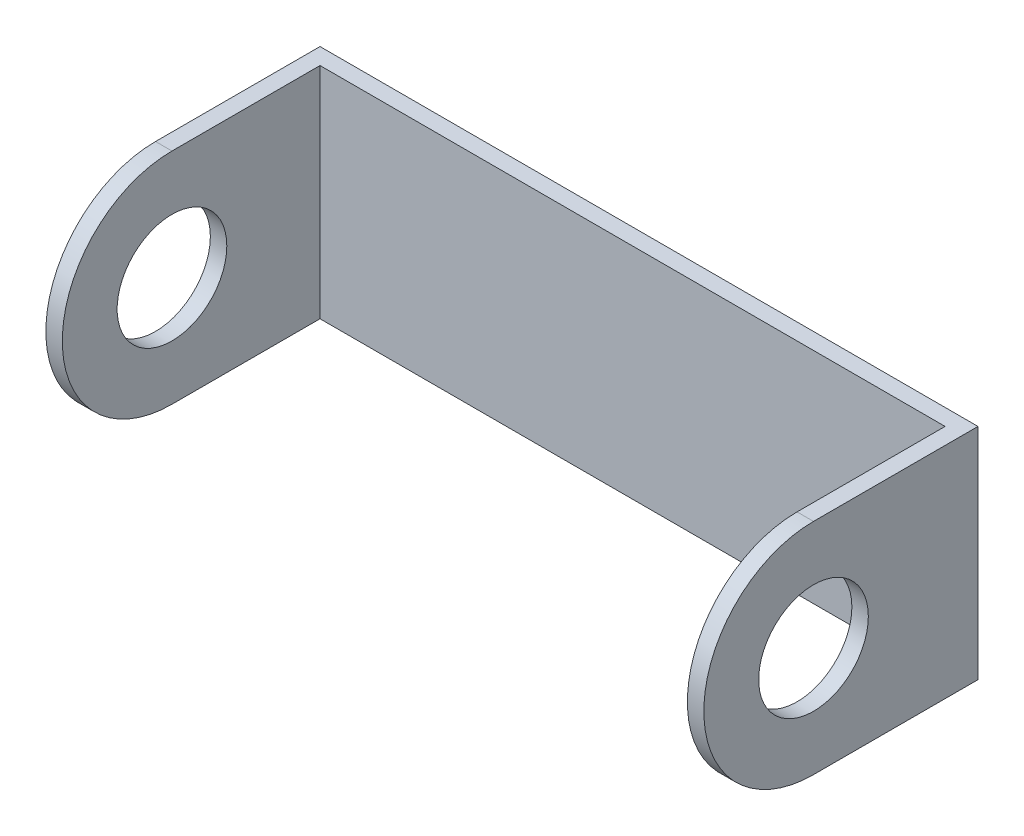
ISO-10303-21;
HEADER;
FILE_DESCRIPTION(('STEP AP214'),'2;1');
FILE_NAME('part.step','',(''),(''),'','','');
FILE_SCHEMA(('AUTOMOTIVE_DESIGN { 1 0 10303 214 1 1 1 1 }'));
ENDSEC;
DATA;
#1=APPLICATION_CONTEXT('core data for automotive mechanical design processes');
#2=APPLICATION_PROTOCOL_DEFINITION('international standard','automotive_design',2000,#1);
#3=PRODUCT_CONTEXT('',#1,'mechanical');
#4=PRODUCT('Part','Part','',(#3));
#5=PRODUCT_RELATED_PRODUCT_CATEGORY('part','',(#4));
#6=PRODUCT_DEFINITION_FORMATION('','',#4);
#7=PRODUCT_DEFINITION_CONTEXT('part definition',#1,'design');
#8=PRODUCT_DEFINITION('design','',#6,#7);
#9=PRODUCT_DEFINITION_SHAPE('','',#8);
#10=(LENGTH_UNIT() NAMED_UNIT(*) SI_UNIT(.MILLI.,.METRE.));
#11=(NAMED_UNIT(*) PLANE_ANGLE_UNIT() SI_UNIT($,.RADIAN.));
#12=(NAMED_UNIT(*) SI_UNIT($,.STERADIAN.) SOLID_ANGLE_UNIT());
#13=UNCERTAINTY_MEASURE_WITH_UNIT(LENGTH_MEASURE(1.E-05),#10,'distance_accuracy_value','');
#14=(GEOMETRIC_REPRESENTATION_CONTEXT(3) GLOBAL_UNCERTAINTY_ASSIGNED_CONTEXT((#13)) GLOBAL_UNIT_ASSIGNED_CONTEXT((#10,
#11,#12)) REPRESENTATION_CONTEXT('',''));
#15=CARTESIAN_POINT('',(0.,0.,0.));
#16=DIRECTION('',(0.,0.,1.));
#17=DIRECTION('',(1.,0.,0.));
#18=AXIS2_PLACEMENT_3D('',#15,#16,#17);
#19=CARTESIAN_POINT('',(57.,-20.,3.));
#20=DIRECTION('',(0.,1.,0.));
#21=DIRECTION('',(0.,0.,1.));
#22=AXIS2_PLACEMENT_3D('',#19,#20,#21);
#23=PLANE('',#22);
#24=DIRECTION('',(-1.,0.,0.));
#25=VECTOR('',#24,1.);
#26=CARTESIAN_POINT('',(57.,-20.,3.));
#27=LINE('',#26,#25);
#28=CARTESIAN_POINT('',(57.,-20.,3.));
#29=VERTEX_POINT('',#28);
#30=CARTESIAN_POINT('',(-57.,-20.,3.));
#31=VERTEX_POINT('',#30);
#32=EDGE_CURVE('E163',#29,#31,#27,.T.);
#33=ORIENTED_EDGE('',*,*,#32,.T.);
#34=DIRECTION('',(0.,0.,-1.));
#35=VECTOR('',#34,1.);
#36=CARTESIAN_POINT('',(-57.,-20.,0.));
#37=LINE('',#36,#35);
#38=CARTESIAN_POINT('',(-57.,-20.,30.));
#39=VERTEX_POINT('',#38);
#40=EDGE_CURVE('E123',#39,#31,#37,.T.);
#41=ORIENTED_EDGE('',*,*,#40,.F.);
#42=DIRECTION('',(1.,0.,0.));
#43=VECTOR('',#42,1.);
#44=CARTESIAN_POINT('',(-60.,-20.,30.));
#45=LINE('',#44,#43);
#46=CARTESIAN_POINT('',(-60.,-20.,30.));
#47=VERTEX_POINT('',#46);
#48=EDGE_CURVE('E115',#47,#39,#45,.T.);
#49=ORIENTED_EDGE('',*,*,#48,.F.);
#50=DIRECTION('',(0.,0.,-1.));
#51=VECTOR('',#50,1.);
#52=CARTESIAN_POINT('',(-60.,-20.,0.));
#53=LINE('',#52,#51);
#54=CARTESIAN_POINT('',(-60.,-20.,0.));
#55=VERTEX_POINT('',#54);
#56=EDGE_CURVE('E107',#47,#55,#53,.T.);
#57=ORIENTED_EDGE('',*,*,#56,.T.);
#58=DIRECTION('',(-1.,0.,0.));
#59=VECTOR('',#58,1.);
#60=CARTESIAN_POINT('',(57.,-20.,0.));
#61=LINE('',#60,#59);
#62=CARTESIAN_POINT('',(60.,-20.,0.));
#63=VERTEX_POINT('',#62);
#64=EDGE_CURVE('E11',#63,#55,#61,.T.);
#65=ORIENTED_EDGE('',*,*,#64,.F.);
#66=DIRECTION('',(0.,0.,-1.));
#67=VECTOR('',#66,1.);
#68=CARTESIAN_POINT('',(60.,-20.,0.));
#69=LINE('',#68,#67);
#70=CARTESIAN_POINT('',(60.,-20.,30.));
#71=VERTEX_POINT('',#70);
#72=EDGE_CURVE('E146',#71,#63,#69,.T.);
#73=ORIENTED_EDGE('',*,*,#72,.F.);
#74=DIRECTION('',(-1.,0.,0.));
#75=VECTOR('',#74,1.);
#76=CARTESIAN_POINT('',(60.,-20.,30.));
#77=LINE('',#76,#75);
#78=CARTESIAN_POINT('',(57.,-20.,30.));
#79=VERTEX_POINT('',#78);
#80=EDGE_CURVE('E148',#71,#79,#77,.T.);
#81=ORIENTED_EDGE('',*,*,#80,.T.);
#82=DIRECTION('',(0.,0.,-1.));
#83=VECTOR('',#82,1.);
#84=CARTESIAN_POINT('',(57.,-20.,0.));
#85=LINE('',#84,#83);
#86=EDGE_CURVE('E142',#79,#29,#85,.T.);
#87=ORIENTED_EDGE('',*,*,#86,.T.);
#88=EDGE_LOOP('',(#33,#41,#49,#57,#65,#73,#81,#87));
#89=FACE_BOUND('',#88,.T.);
#90=ADVANCED_FACE('F33',(#89),#23,.F.);
#91=CARTESIAN_POINT('',(57.,-20.,0.));
#92=DIRECTION('',(0.,0.,1.));
#93=DIRECTION('',(1.,0.,0.));
#94=AXIS2_PLACEMENT_3D('',#91,#92,#93);
#95=PLANE('',#94);
#96=ORIENTED_EDGE('',*,*,#64,.T.);
#97=DIRECTION('',(0.,1.,0.));
#98=VECTOR('',#97,1.);
#99=CARTESIAN_POINT('',(-60.,20.,0.));
#100=LINE('',#99,#98);
#101=CARTESIAN_POINT('',(-60.,20.,0.));
#102=VERTEX_POINT('',#101);
#103=EDGE_CURVE('E95',#55,#102,#100,.T.);
#104=ORIENTED_EDGE('',*,*,#103,.T.);
#105=DIRECTION('',(-1.,0.,0.));
#106=VECTOR('',#105,1.);
#107=CARTESIAN_POINT('',(57.,20.,0.));
#108=LINE('',#107,#106);
#109=CARTESIAN_POINT('',(60.,20.,0.));
#110=VERTEX_POINT('',#109);
#111=EDGE_CURVE('E41',#110,#102,#108,.T.);
#112=ORIENTED_EDGE('',*,*,#111,.F.);
#113=DIRECTION('',(0.,1.,0.));
#114=VECTOR('',#113,1.);
#115=CARTESIAN_POINT('',(60.,20.,0.));
#116=LINE('',#115,#114);
#117=EDGE_CURVE('E98',#63,#110,#116,.T.);
#118=ORIENTED_EDGE('',*,*,#117,.F.);
#119=EDGE_LOOP('',(#96,#104,#112,#118));
#120=FACE_BOUND('',#119,.T.);
#121=ADVANCED_FACE('F94',(#120),#95,.F.);
#122=CARTESIAN_POINT('',(57.,20.,0.));
#123=DIRECTION('',(0.,-1.,0.));
#124=DIRECTION('',(0.,0.,-1.));
#125=AXIS2_PLACEMENT_3D('',#122,#123,#124);
#126=PLANE('',#125);
#127=ORIENTED_EDGE('',*,*,#111,.T.);
#128=DIRECTION('',(0.,0.,1.));
#129=VECTOR('',#128,1.);
#130=CARTESIAN_POINT('',(-60.,20.,0.));
#131=LINE('',#130,#129);
#132=CARTESIAN_POINT('',(-60.,20.,30.));
#133=VERTEX_POINT('',#132);
#134=EDGE_CURVE('E110',#102,#133,#131,.T.);
#135=ORIENTED_EDGE('',*,*,#134,.T.);
#136=DIRECTION('',(1.,0.,0.));
#137=VECTOR('',#136,1.);
#138=CARTESIAN_POINT('',(-60.,20.,30.));
#139=LINE('',#138,#137);
#140=CARTESIAN_POINT('',(-57.,20.,30.));
#141=VERTEX_POINT('',#140);
#142=EDGE_CURVE('E122',#133,#141,#139,.T.);
#143=ORIENTED_EDGE('',*,*,#142,.T.);
#144=DIRECTION('',(0.,0.,1.));
#145=VECTOR('',#144,1.);
#146=CARTESIAN_POINT('',(-57.,20.,0.));
#147=LINE('',#146,#145);
#148=CARTESIAN_POINT('',(-57.,20.,3.));
#149=VERTEX_POINT('',#148);
#150=EDGE_CURVE('E111',#149,#141,#147,.T.);
#151=ORIENTED_EDGE('',*,*,#150,.F.);
#152=DIRECTION('',(-1.,0.,0.));
#153=VECTOR('',#152,1.);
#154=CARTESIAN_POINT('',(57.,20.,3.));
#155=LINE('',#154,#153);
#156=CARTESIAN_POINT('',(57.,20.,3.));
#157=VERTEX_POINT('',#156);
#158=EDGE_CURVE('E47',#157,#149,#155,.T.);
#159=ORIENTED_EDGE('',*,*,#158,.F.);
#160=DIRECTION('',(0.,0.,1.));
#161=VECTOR('',#160,1.);
#162=CARTESIAN_POINT('',(57.,20.,0.));
#163=LINE('',#162,#161);
#164=CARTESIAN_POINT('',(57.,20.,30.));
#165=VERTEX_POINT('',#164);
#166=EDGE_CURVE('E137',#157,#165,#163,.T.);
#167=ORIENTED_EDGE('',*,*,#166,.T.);
#168=DIRECTION('',(-1.,0.,0.));
#169=VECTOR('',#168,1.);
#170=CARTESIAN_POINT('',(60.,20.,30.));
#171=LINE('',#170,#169);
#172=CARTESIAN_POINT('',(60.,20.,30.));
#173=VERTEX_POINT('',#172);
#174=EDGE_CURVE('E156',#173,#165,#171,.T.);
#175=ORIENTED_EDGE('',*,*,#174,.F.);
#176=DIRECTION('',(0.,0.,1.));
#177=VECTOR('',#176,1.);
#178=CARTESIAN_POINT('',(60.,20.,0.));
#179=LINE('',#178,#177);
#180=EDGE_CURVE('E141',#110,#173,#179,.T.);
#181=ORIENTED_EDGE('',*,*,#180,.F.);
#182=EDGE_LOOP('',(#127,#135,#143,#151,#159,#167,#175,#181));
#183=FACE_BOUND('',#182,.T.);
#184=ADVANCED_FACE('F168',(#183),#126,.F.);
#185=CARTESIAN_POINT('',(57.,20.,3.));
#186=DIRECTION('',(0.,0.,-1.));
#187=DIRECTION('',(-1.,0.,0.));
#188=AXIS2_PLACEMENT_3D('',#185,#186,#187);
#189=PLANE('',#188);
#190=DIRECTION('',(0.,-1.,0.));
#191=VECTOR('',#190,1.);
#192=CARTESIAN_POINT('',(-57.,20.,3.));
#193=LINE('',#192,#191);
#194=EDGE_CURVE('E159',#149,#31,#193,.T.);
#195=ORIENTED_EDGE('',*,*,#194,.T.);
#196=ORIENTED_EDGE('',*,*,#32,.F.);
#197=DIRECTION('',(0.,-1.,0.));
#198=VECTOR('',#197,1.);
#199=CARTESIAN_POINT('',(57.,20.,3.));
#200=LINE('',#199,#198);
#201=EDGE_CURVE('E160',#157,#29,#200,.T.);
#202=ORIENTED_EDGE('',*,*,#201,.F.);
#203=ORIENTED_EDGE('',*,*,#158,.T.);
#204=EDGE_LOOP('',(#195,#196,#202,#203));
#205=FACE_BOUND('',#204,.T.);
#206=ADVANCED_FACE('F182',(#205),#189,.F.);
#207=CARTESIAN_POINT('',(57.,0.,30.));
#208=DIRECTION('',(1.,0.,0.));
#209=DIRECTION('',(0.,0.,-1.));
#210=AXIS2_PLACEMENT_3D('',#207,#208,#209);
#211=PLANE('',#210);
#212=CARTESIAN_POINT('',(57.,0.,30.));
#213=DIRECTION('',(1.,0.,0.));
#214=DIRECTION('',(0.,0.,-1.));
#215=AXIS2_PLACEMENT_3D('',#212,#213,#214);
#216=CIRCLE('',#215,10.);
#217=CARTESIAN_POINT('',(57.,0.,20.));
#218=VERTEX_POINT('',#217);
#219=EDGE_CURVE('E133',#218,#218,#216,.T.);
#220=ORIENTED_EDGE('',*,*,#219,.T.);
#221=EDGE_LOOP('',(#220));
#222=FACE_BOUND('',#221,.T.);
#223=ORIENTED_EDGE('',*,*,#166,.F.);
#224=ORIENTED_EDGE('',*,*,#201,.T.);
#225=ORIENTED_EDGE('',*,*,#86,.F.);
#226=CARTESIAN_POINT('',(57.,0.,30.));
#227=DIRECTION('',(1.,0.,0.));
#228=DIRECTION('',(0.,0.,-1.));
#229=AXIS2_PLACEMENT_3D('',#226,#227,#228);
#230=CIRCLE('',#229,20.);
#231=EDGE_CURVE('E150',#165,#79,#230,.T.);
#232=ORIENTED_EDGE('',*,*,#231,.F.);
#233=EDGE_LOOP('',(#223,#224,#225,#232));
#234=FACE_BOUND('',#233,.T.);
#235=ADVANCED_FACE('F180',(#222,#234),#211,.F.);
#236=CARTESIAN_POINT('',(60.,0.,30.));
#237=DIRECTION('',(1.,0.,0.));
#238=DIRECTION('',(0.,0.,-1.));
#239=AXIS2_PLACEMENT_3D('',#236,#237,#238);
#240=PLANE('',#239);
#241=ORIENTED_EDGE('',*,*,#117,.T.);
#242=ORIENTED_EDGE('',*,*,#180,.T.);
#243=CARTESIAN_POINT('',(60.,0.,30.));
#244=DIRECTION('',(1.,0.,0.));
#245=DIRECTION('',(0.,0.,-1.));
#246=AXIS2_PLACEMENT_3D('',#243,#244,#245);
#247=CIRCLE('',#246,20.);
#248=EDGE_CURVE('E144',#173,#71,#247,.T.);
#249=ORIENTED_EDGE('',*,*,#248,.T.);
#250=ORIENTED_EDGE('',*,*,#72,.T.);
#251=EDGE_LOOP('',(#241,#242,#249,#250));
#252=FACE_BOUND('',#251,.T.);
#253=CARTESIAN_POINT('',(60.,0.,30.));
#254=DIRECTION('',(1.,0.,0.));
#255=DIRECTION('',(0.,0.,-1.));
#256=AXIS2_PLACEMENT_3D('',#253,#254,#255);
#257=CIRCLE('',#256,10.);
#258=CARTESIAN_POINT('',(60.,0.,20.));
#259=VERTEX_POINT('',#258);
#260=EDGE_CURVE('E134',#259,#259,#257,.T.);
#261=ORIENTED_EDGE('',*,*,#260,.F.);
#262=EDGE_LOOP('',(#261));
#263=FACE_BOUND('',#262,.T.);
#264=ADVANCED_FACE('F172',(#252,#263),#240,.T.);
#265=CARTESIAN_POINT('',(60.,0.,30.));
#266=DIRECTION('',(-1.,0.,0.));
#267=DIRECTION('',(0.,0.,1.));
#268=AXIS2_PLACEMENT_3D('',#265,#266,#267);
#269=CYLINDRICAL_SURFACE('',#268,20.);
#270=ORIENTED_EDGE('',*,*,#231,.T.);
#271=ORIENTED_EDGE('',*,*,#80,.F.);
#272=ORIENTED_EDGE('',*,*,#248,.F.);
#273=ORIENTED_EDGE('',*,*,#174,.T.);
#274=EDGE_LOOP('',(#270,#271,#272,#273));
#275=FACE_BOUND('',#274,.T.);
#276=ADVANCED_FACE('F198',(#275),#269,.T.);
#277=CARTESIAN_POINT('',(60.,0.,30.));
#278=DIRECTION('',(-1.,0.,0.));
#279=DIRECTION('',(0.,0.,1.));
#280=AXIS2_PLACEMENT_3D('',#277,#278,#279);
#281=CYLINDRICAL_SURFACE('',#280,10.);
#282=ORIENTED_EDGE('',*,*,#260,.T.);
#283=EDGE_LOOP('',(#282));
#284=FACE_BOUND('',#283,.T.);
#285=ORIENTED_EDGE('',*,*,#219,.F.);
#286=EDGE_LOOP('',(#285));
#287=FACE_BOUND('',#286,.T.);
#288=ADVANCED_FACE('F190',(#284,#287),#281,.F.);
#289=CARTESIAN_POINT('',(-60.,0.,30.));
#290=DIRECTION('',(1.,0.,0.));
#291=DIRECTION('',(0.,0.,-1.));
#292=AXIS2_PLACEMENT_3D('',#289,#290,#291);
#293=CYLINDRICAL_SURFACE('',#292,20.);
#294=CARTESIAN_POINT('',(-57.,0.,30.));
#295=DIRECTION('',(1.,0.,0.));
#296=DIRECTION('',(0.,0.,-1.));
#297=AXIS2_PLACEMENT_3D('',#294,#295,#296);
#298=CIRCLE('',#297,20.);
#299=EDGE_CURVE('E125',#141,#39,#298,.T.);
#300=ORIENTED_EDGE('',*,*,#299,.F.);
#301=ORIENTED_EDGE('',*,*,#142,.F.);
#302=CARTESIAN_POINT('',(-60.,0.,30.));
#303=DIRECTION('',(1.,0.,0.));
#304=DIRECTION('',(0.,0.,-1.));
#305=AXIS2_PLACEMENT_3D('',#302,#303,#304);
#306=CIRCLE('',#305,20.);
#307=EDGE_CURVE('E116',#133,#47,#306,.T.);
#308=ORIENTED_EDGE('',*,*,#307,.T.);
#309=ORIENTED_EDGE('',*,*,#48,.T.);
#310=EDGE_LOOP('',(#300,#301,#308,#309));
#311=FACE_BOUND('',#310,.T.);
#312=ADVANCED_FACE('F188',(#311),#293,.T.);
#313=CARTESIAN_POINT('',(-60.,0.,30.));
#314=DIRECTION('',(-1.,0.,0.));
#315=DIRECTION('',(0.,0.,-1.));
#316=AXIS2_PLACEMENT_3D('',#313,#314,#315);
#317=PLANE('',#316);
#318=CARTESIAN_POINT('',(-60.,0.,30.));
#319=DIRECTION('',(1.,0.,0.));
#320=DIRECTION('',(0.,0.,-1.));
#321=AXIS2_PLACEMENT_3D('',#318,#319,#320);
#322=CIRCLE('',#321,10.);
#323=CARTESIAN_POINT('',(-60.,0.,20.));
#324=VERTEX_POINT('',#323);
#325=EDGE_CURVE('E126',#324,#324,#322,.T.);
#326=ORIENTED_EDGE('',*,*,#325,.T.);
#327=EDGE_LOOP('',(#326));
#328=FACE_BOUND('',#327,.T.);
#329=ORIENTED_EDGE('',*,*,#103,.F.);
#330=ORIENTED_EDGE('',*,*,#56,.F.);
#331=ORIENTED_EDGE('',*,*,#307,.F.);
#332=ORIENTED_EDGE('',*,*,#134,.F.);
#333=EDGE_LOOP('',(#329,#330,#331,#332));
#334=FACE_BOUND('',#333,.T.);
#335=ADVANCED_FACE('F105',(#328,#334),#317,.T.);
#336=CARTESIAN_POINT('',(-57.,0.,30.));
#337=DIRECTION('',(-1.,0.,0.));
#338=DIRECTION('',(0.,0.,-1.));
#339=AXIS2_PLACEMENT_3D('',#336,#337,#338);
#340=PLANE('',#339);
#341=ORIENTED_EDGE('',*,*,#194,.F.);
#342=ORIENTED_EDGE('',*,*,#150,.T.);
#343=ORIENTED_EDGE('',*,*,#299,.T.);
#344=ORIENTED_EDGE('',*,*,#40,.T.);
#345=EDGE_LOOP('',(#341,#342,#343,#344));
#346=FACE_BOUND('',#345,.T.);
#347=CARTESIAN_POINT('',(-57.,0.,30.));
#348=DIRECTION('',(1.,0.,0.));
#349=DIRECTION('',(0.,0.,-1.));
#350=AXIS2_PLACEMENT_3D('',#347,#348,#349);
#351=CIRCLE('',#350,10.);
#352=CARTESIAN_POINT('',(-57.,0.,20.));
#353=VERTEX_POINT('',#352);
#354=EDGE_CURVE('E291',#353,#353,#351,.T.);
#355=ORIENTED_EDGE('',*,*,#354,.F.);
#356=EDGE_LOOP('',(#355));
#357=FACE_BOUND('',#356,.T.);
#358=ADVANCED_FACE('F185',(#346,#357),#340,.F.);
#359=CARTESIAN_POINT('',(-60.,0.,30.));
#360=DIRECTION('',(1.,0.,0.));
#361=DIRECTION('',(0.,0.,-1.));
#362=AXIS2_PLACEMENT_3D('',#359,#360,#361);
#363=CYLINDRICAL_SURFACE('',#362,10.);
#364=ORIENTED_EDGE('',*,*,#325,.F.);
#365=EDGE_LOOP('',(#364));
#366=FACE_BOUND('',#365,.T.);
#367=ORIENTED_EDGE('',*,*,#354,.T.);
#368=EDGE_LOOP('',(#367));
#369=FACE_BOUND('',#368,.T.);
#370=ADVANCED_FACE('F274',(#366,#369),#363,.F.);
#371=CLOSED_SHELL('',(#90,#121,#184,#206,#235,#264,#276,#288,#312,#335,#358,#370));
#372=MANIFOLD_SOLID_BREP('B2',#371);
#373=ADVANCED_BREP_SHAPE_REPRESENTATION('',(#18,#372),#14);
#374=SHAPE_DEFINITION_REPRESENTATION(#9,#373);
ENDSEC;
END-ISO-10303-21;
